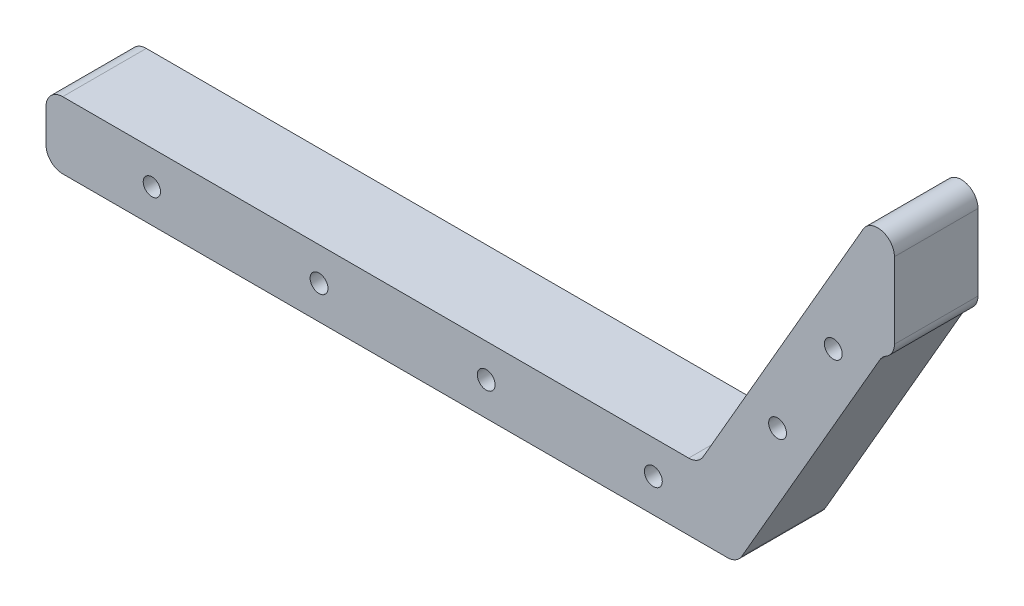
ISO-10303-21;
HEADER;
FILE_DESCRIPTION(('STEP AP214'),'2;1');
FILE_NAME('part.step','',(''),(''),'','','');
FILE_SCHEMA(('AUTOMOTIVE_DESIGN { 1 0 10303 214 1 1 1 1 }'));
ENDSEC;
DATA;
#1=APPLICATION_CONTEXT('core data for automotive mechanical design processes');
#2=APPLICATION_PROTOCOL_DEFINITION('international standard','automotive_design',2000,#1);
#3=PRODUCT_CONTEXT('',#1,'mechanical');
#4=PRODUCT('Part','Part','',(#3));
#5=PRODUCT_RELATED_PRODUCT_CATEGORY('part','',(#4));
#6=PRODUCT_DEFINITION_FORMATION('','',#4);
#7=PRODUCT_DEFINITION_CONTEXT('part definition',#1,'design');
#8=PRODUCT_DEFINITION('design','',#6,#7);
#9=PRODUCT_DEFINITION_SHAPE('','',#8);
#10=(LENGTH_UNIT() NAMED_UNIT(*) SI_UNIT(.MILLI.,.METRE.));
#11=(NAMED_UNIT(*) PLANE_ANGLE_UNIT() SI_UNIT($,.RADIAN.));
#12=(NAMED_UNIT(*) SI_UNIT($,.STERADIAN.) SOLID_ANGLE_UNIT());
#13=UNCERTAINTY_MEASURE_WITH_UNIT(LENGTH_MEASURE(1.E-05),#10,'distance_accuracy_value','');
#14=(GEOMETRIC_REPRESENTATION_CONTEXT(3) GLOBAL_UNCERTAINTY_ASSIGNED_CONTEXT((#13)) GLOBAL_UNIT_ASSIGNED_CONTEXT((#10,
#11,#12)) REPRESENTATION_CONTEXT('',''));
#15=CARTESIAN_POINT('',(0.,0.,0.));
#16=DIRECTION('',(0.,0.,1.));
#17=DIRECTION('',(1.,0.,0.));
#18=AXIS2_PLACEMENT_3D('',#15,#16,#17);
#19=CARTESIAN_POINT('',(80.2679491924311,3.00000000000004,15.));
#20=DIRECTION('',(0.,0.,1.));
#21=DIRECTION('',(1.,0.,0.));
#22=AXIS2_PLACEMENT_3D('',#19,#20,#21);
#23=PLANE('',#22);
#24=DIRECTION('',(0.,-1.,0.));
#25=VECTOR('',#24,1.);
#26=CARTESIAN_POINT('',(-42.,12.,15.));
#27=LINE('',#26,#25);
#28=CARTESIAN_POINT('',(-42.,8.99999999999998,15.));
#29=VERTEX_POINT('',#28);
#30=CARTESIAN_POINT('',(-42.,2.99999999999999,15.));
#31=VERTEX_POINT('',#30);
#32=EDGE_CURVE('E207',#29,#31,#27,.T.);
#33=ORIENTED_EDGE('',*,*,#32,.T.);
#34=CARTESIAN_POINT('',(-39.,2.99999999999999,15.));
#35=DIRECTION('',(0.,0.,1.));
#36=DIRECTION('',(1.,0.,0.));
#37=AXIS2_PLACEMENT_3D('',#34,#35,#36);
#38=CIRCLE('',#37,3.);
#39=CARTESIAN_POINT('',(-39.,0.,15.));
#40=VERTEX_POINT('',#39);
#41=EDGE_CURVE('E192',#31,#40,#38,.T.);
#42=ORIENTED_EDGE('',*,*,#41,.T.);
#43=DIRECTION('',(1.,0.,0.));
#44=VECTOR('',#43,1.);
#45=CARTESIAN_POINT('',(0.,0.,15.));
#46=LINE('',#45,#44);
#47=CARTESIAN_POINT('',(80.2679491924311,0.,15.));
#48=VERTEX_POINT('',#47);
#49=EDGE_CURVE('E153',#40,#48,#46,.T.);
#50=ORIENTED_EDGE('',*,*,#49,.T.);
#51=CARTESIAN_POINT('',(80.2679491924311,3.00000000000004,15.));
#52=DIRECTION('',(0.,0.,1.));
#53=DIRECTION('',(1.,0.,0.));
#54=AXIS2_PLACEMENT_3D('',#51,#52,#53);
#55=CIRCLE('',#54,3.);
#56=CARTESIAN_POINT('',(82.8660254037844,1.50000000000005,15.));
#57=VERTEX_POINT('',#56);
#58=EDGE_CURVE('E148',#48,#57,#55,.T.);
#59=ORIENTED_EDGE('',*,*,#58,.T.);
#60=DIRECTION('',(0.499999999999998,0.86602540378444,0.));
#61=VECTOR('',#60,1.);
#62=CARTESIAN_POINT('',(82.8660254037844,1.50000000000005,15.));
#63=LINE('',#62,#61);
#64=CARTESIAN_POINT('',(107.664319481613,44.451905283833,15.));
#65=VERTEX_POINT('',#64);
#66=EDGE_CURVE('E136',#57,#65,#63,.T.);
#67=ORIENTED_EDGE('',*,*,#66,.T.);
#68=CARTESIAN_POINT('',(110.262395692966,42.951905283833,15.));
#69=DIRECTION('',(0.,0.,-1.));
#70=DIRECTION('',(1.,0.,0.));
#71=AXIS2_PLACEMENT_3D('',#68,#69,#70);
#72=CIRCLE('',#71,3.);
#73=CARTESIAN_POINT('',(108.762395692966,45.5499814951863,15.));
#74=VERTEX_POINT('',#73);
#75=EDGE_CURVE('E147',#65,#74,#72,.T.);
#76=ORIENTED_EDGE('',*,*,#75,.T.);
#77=CARTESIAN_POINT('',(107.262395692966,48.1480577065396,15.));
#78=DIRECTION('',(0.,0.,1.));
#79=DIRECTION('',(1.,0.,0.));
#80=AXIS2_PLACEMENT_3D('',#77,#78,#79);
#81=CIRCLE('',#80,3.);
#82=CARTESIAN_POINT('',(110.262395692966,48.1480577065396,15.));
#83=VERTEX_POINT('',#82);
#84=EDGE_CURVE('E171',#74,#83,#81,.T.);
#85=ORIENTED_EDGE('',*,*,#84,.T.);
#86=DIRECTION('',(0.,1.,0.));
#87=VECTOR('',#86,1.);
#88=CARTESIAN_POINT('',(110.262395692966,45.951905283833,15.));
#89=LINE('',#88,#87);
#90=CARTESIAN_POINT('',(110.262395692966,61.7557528611264,15.));
#91=VERTEX_POINT('',#90);
#92=EDGE_CURVE('E290',#83,#91,#89,.T.);
#93=ORIENTED_EDGE('',*,*,#92,.T.);
#94=CARTESIAN_POINT('',(107.262395692966,61.7557528611264,15.));
#95=DIRECTION('',(0.,0.,1.));
#96=DIRECTION('',(1.,0.,0.));
#97=AXIS2_PLACEMENT_3D('',#94,#95,#96);
#98=CIRCLE('',#97,3.);
#99=CARTESIAN_POINT('',(104.664319481613,63.2557528611264,15.));
#100=VERTEX_POINT('',#99);
#101=EDGE_CURVE('E173',#91,#100,#98,.T.);
#102=ORIENTED_EDGE('',*,*,#101,.T.);
#103=DIRECTION('',(-0.499999999999998,-0.86602540378444,0.));
#104=VECTOR('',#103,1.);
#105=CARTESIAN_POINT('',(110.262395692966,72.9519052838331,15.));
#106=LINE('',#105,#104);
#107=CARTESIAN_POINT('',(75.9378221735089,13.5,15.));
#108=VERTEX_POINT('',#107);
#109=EDGE_CURVE('E293',#100,#108,#106,.T.);
#110=ORIENTED_EDGE('',*,*,#109,.T.);
#111=CARTESIAN_POINT('',(73.3397459621556,15.,15.));
#112=DIRECTION('',(0.,0.,-1.));
#113=DIRECTION('',(1.,0.,0.));
#114=AXIS2_PLACEMENT_3D('',#111,#112,#113);
#115=CIRCLE('',#114,3.);
#116=CARTESIAN_POINT('',(73.3397459621556,12.,15.));
#117=VERTEX_POINT('',#116);
#118=EDGE_CURVE('E217',#108,#117,#115,.T.);
#119=ORIENTED_EDGE('',*,*,#118,.T.);
#120=DIRECTION('',(-1.,0.,0.));
#121=VECTOR('',#120,1.);
#122=CARTESIAN_POINT('',(73.3397459621556,12.,15.));
#123=LINE('',#122,#121);
#124=CARTESIAN_POINT('',(-38.9999999999999,12.,15.));
#125=VERTEX_POINT('',#124);
#126=EDGE_CURVE('E212',#117,#125,#123,.T.);
#127=ORIENTED_EDGE('',*,*,#126,.T.);
#128=CARTESIAN_POINT('',(-39.,8.99999999999998,15.));
#129=DIRECTION('',(0.,0.,1.));
#130=DIRECTION('',(1.,0.,0.));
#131=AXIS2_PLACEMENT_3D('',#128,#129,#130);
#132=CIRCLE('',#131,3.);
#133=EDGE_CURVE('E190',#125,#29,#132,.T.);
#134=ORIENTED_EDGE('',*,*,#133,.T.);
#135=EDGE_LOOP('',(#33,#42,#50,#59,#67,#76,#85,#93,#102,#110,#119,#127,#134));
#136=FACE_BOUND('',#135,.T.);
#137=CARTESIAN_POINT('',(37.,6.00000000000001,15.));
#138=DIRECTION('',(0.,0.,1.));
#139=DIRECTION('',(1.,0.,0.));
#140=AXIS2_PLACEMENT_3D('',#137,#138,#139);
#141=CIRCLE('',#140,1.60000000000001);
#142=CARTESIAN_POINT('',(38.6,6.00000000000001,15.));
#143=VERTEX_POINT('',#142);
#144=EDGE_CURVE('E267',#143,#143,#141,.T.);
#145=ORIENTED_EDGE('',*,*,#144,.F.);
#146=EDGE_LOOP('',(#145));
#147=FACE_BOUND('',#146,.T.);
#148=CARTESIAN_POINT('',(89.2927405783631,24.6313972081442,15.));
#149=DIRECTION('',(0.,0.,1.));
#150=DIRECTION('',(1.,0.,0.));
#151=AXIS2_PLACEMENT_3D('',#148,#149,#150);
#152=CIRCLE('',#151,1.6);
#153=CARTESIAN_POINT('',(90.8927405783631,24.6313972081442,15.));
#154=VERTEX_POINT('',#153);
#155=EDGE_CURVE('E279',#154,#154,#152,.T.);
#156=ORIENTED_EDGE('',*,*,#155,.F.);
#157=EDGE_LOOP('',(#156));
#158=FACE_BOUND('',#157,.T.);
#159=CARTESIAN_POINT('',(99.2927405783631,41.951905283833,15.));
#160=DIRECTION('',(0.,0.,1.));
#161=DIRECTION('',(1.,0.,0.));
#162=AXIS2_PLACEMENT_3D('',#159,#160,#161);
#163=CIRCLE('',#162,1.6);
#164=CARTESIAN_POINT('',(100.892740578363,41.951905283833,15.));
#165=VERTEX_POINT('',#164);
#166=EDGE_CURVE('E223',#165,#165,#163,.T.);
#167=ORIENTED_EDGE('',*,*,#166,.F.);
#168=EDGE_LOOP('',(#167));
#169=FACE_BOUND('',#168,.T.);
#170=CARTESIAN_POINT('',(67.,6.00000000000001,15.));
#171=DIRECTION('',(0.,0.,1.));
#172=DIRECTION('',(1.,0.,0.));
#173=AXIS2_PLACEMENT_3D('',#170,#171,#172);
#174=CIRCLE('',#173,1.60000000000001);
#175=CARTESIAN_POINT('',(68.6,6.00000000000001,15.));
#176=VERTEX_POINT('',#175);
#177=EDGE_CURVE('E273',#176,#176,#174,.T.);
#178=ORIENTED_EDGE('',*,*,#177,.F.);
#179=EDGE_LOOP('',(#178));
#180=FACE_BOUND('',#179,.T.);
#181=CARTESIAN_POINT('',(6.99999999999998,6.00000000000001,15.));
#182=DIRECTION('',(0.,0.,1.));
#183=DIRECTION('',(1.,0.,0.));
#184=AXIS2_PLACEMENT_3D('',#181,#182,#183);
#185=CIRCLE('',#184,1.59999999999999);
#186=CARTESIAN_POINT('',(8.59999999999997,6.00000000000001,15.));
#187=VERTEX_POINT('',#186);
#188=EDGE_CURVE('E261',#187,#187,#185,.T.);
#189=ORIENTED_EDGE('',*,*,#188,.F.);
#190=EDGE_LOOP('',(#189));
#191=FACE_BOUND('',#190,.T.);
#192=CARTESIAN_POINT('',(-23.,5.99999999999999,15.));
#193=DIRECTION('',(0.,0.,1.));
#194=DIRECTION('',(1.,0.,0.));
#195=AXIS2_PLACEMENT_3D('',#192,#193,#194);
#196=CIRCLE('',#195,1.55);
#197=CARTESIAN_POINT('',(-21.45,5.99999999999999,15.));
#198=VERTEX_POINT('',#197);
#199=EDGE_CURVE('E257',#198,#198,#196,.T.);
#200=ORIENTED_EDGE('',*,*,#199,.F.);
#201=EDGE_LOOP('',(#200));
#202=FACE_BOUND('',#201,.T.);
#203=ADVANCED_FACE('F38',(#136,#147,#158,#169,#180,#191,#202),#23,.T.);
#204=CARTESIAN_POINT('',(80.2679491924311,3.00000000000004,0.));
#205=DIRECTION('',(0.,0.,1.));
#206=DIRECTION('',(1.,0.,0.));
#207=AXIS2_PLACEMENT_3D('',#204,#205,#206);
#208=PLANE('',#207);
#209=DIRECTION('',(1.,0.,0.));
#210=VECTOR('',#209,1.);
#211=CARTESIAN_POINT('',(0.,0.,0.));
#212=LINE('',#211,#210);
#213=CARTESIAN_POINT('',(-39.,0.,0.));
#214=VERTEX_POINT('',#213);
#215=CARTESIAN_POINT('',(80.2679491924311,0.,0.));
#216=VERTEX_POINT('',#215);
#217=EDGE_CURVE('E157',#214,#216,#212,.T.);
#218=ORIENTED_EDGE('',*,*,#217,.F.);
#219=CARTESIAN_POINT('',(-39.,2.99999999999999,0.));
#220=DIRECTION('',(0.,0.,1.));
#221=DIRECTION('',(1.,0.,0.));
#222=AXIS2_PLACEMENT_3D('',#219,#220,#221);
#223=CIRCLE('',#222,3.);
#224=CARTESIAN_POINT('',(-42.,2.99999999999999,0.));
#225=VERTEX_POINT('',#224);
#226=EDGE_CURVE('E46',#214,#225,#223,.F.);
#227=ORIENTED_EDGE('',*,*,#226,.T.);
#228=DIRECTION('',(0.,-1.,0.));
#229=VECTOR('',#228,1.);
#230=CARTESIAN_POINT('',(-42.,12.,0.));
#231=LINE('',#230,#229);
#232=CARTESIAN_POINT('',(-42.,8.99999999999998,0.));
#233=VERTEX_POINT('',#232);
#234=EDGE_CURVE('E199',#233,#225,#231,.T.);
#235=ORIENTED_EDGE('',*,*,#234,.F.);
#236=CARTESIAN_POINT('',(-39.,8.99999999999998,0.));
#237=DIRECTION('',(0.,0.,1.));
#238=DIRECTION('',(1.,0.,0.));
#239=AXIS2_PLACEMENT_3D('',#236,#237,#238);
#240=CIRCLE('',#239,3.);
#241=CARTESIAN_POINT('',(-38.9999999999999,12.,0.));
#242=VERTEX_POINT('',#241);
#243=EDGE_CURVE('E53',#233,#242,#240,.F.);
#244=ORIENTED_EDGE('',*,*,#243,.T.);
#245=DIRECTION('',(-1.,0.,0.));
#246=VECTOR('',#245,1.);
#247=CARTESIAN_POINT('',(73.3397459621556,12.,0.));
#248=LINE('',#247,#246);
#249=CARTESIAN_POINT('',(73.3397459621556,12.,0.));
#250=VERTEX_POINT('',#249);
#251=EDGE_CURVE('E235',#250,#242,#248,.T.);
#252=ORIENTED_EDGE('',*,*,#251,.F.);
#253=CARTESIAN_POINT('',(73.3397459621556,15.,0.));
#254=DIRECTION('',(0.,0.,-1.));
#255=DIRECTION('',(1.,0.,0.));
#256=AXIS2_PLACEMENT_3D('',#253,#254,#255);
#257=CIRCLE('',#256,3.);
#258=CARTESIAN_POINT('',(75.9378221735089,13.5,0.));
#259=VERTEX_POINT('',#258);
#260=EDGE_CURVE('E233',#259,#250,#257,.T.);
#261=ORIENTED_EDGE('',*,*,#260,.F.);
#262=DIRECTION('',(-0.499999999999998,-0.86602540378444,0.));
#263=VECTOR('',#262,1.);
#264=CARTESIAN_POINT('',(110.262395692966,72.9519052838331,0.));
#265=LINE('',#264,#263);
#266=CARTESIAN_POINT('',(104.664319481613,63.2557528611264,0.));
#267=VERTEX_POINT('',#266);
#268=EDGE_CURVE('E231',#267,#259,#265,.T.);
#269=ORIENTED_EDGE('',*,*,#268,.F.);
#270=CARTESIAN_POINT('',(107.262395692966,61.7557528611264,0.));
#271=DIRECTION('',(0.,0.,1.));
#272=DIRECTION('',(1.,0.,0.));
#273=AXIS2_PLACEMENT_3D('',#270,#271,#272);
#274=CIRCLE('',#273,3.);
#275=CARTESIAN_POINT('',(110.262395692966,61.7557528611264,0.));
#276=VERTEX_POINT('',#275);
#277=EDGE_CURVE('E164',#267,#276,#274,.F.);
#278=ORIENTED_EDGE('',*,*,#277,.T.);
#279=DIRECTION('',(0.,1.,0.));
#280=VECTOR('',#279,1.);
#281=CARTESIAN_POINT('',(110.262395692966,45.951905283833,0.));
#282=LINE('',#281,#280);
#283=CARTESIAN_POINT('',(110.262395692966,48.1480577065396,0.));
#284=VERTEX_POINT('',#283);
#285=EDGE_CURVE('E228',#284,#276,#282,.T.);
#286=ORIENTED_EDGE('',*,*,#285,.F.);
#287=CARTESIAN_POINT('',(107.262395692966,48.1480577065396,0.));
#288=DIRECTION('',(0.,0.,1.));
#289=DIRECTION('',(1.,0.,0.));
#290=AXIS2_PLACEMENT_3D('',#287,#288,#289);
#291=CIRCLE('',#290,3.);
#292=CARTESIAN_POINT('',(108.762395692966,45.5499814951863,0.));
#293=VERTEX_POINT('',#292);
#294=EDGE_CURVE('E162',#284,#293,#291,.F.);
#295=ORIENTED_EDGE('',*,*,#294,.T.);
#296=CARTESIAN_POINT('',(110.262395692966,42.951905283833,0.));
#297=DIRECTION('',(0.,0.,-1.));
#298=DIRECTION('',(1.,0.,0.));
#299=AXIS2_PLACEMENT_3D('',#296,#297,#298);
#300=CIRCLE('',#299,3.);
#301=CARTESIAN_POINT('',(107.664319481613,44.451905283833,0.));
#302=VERTEX_POINT('',#301);
#303=EDGE_CURVE('E225',#302,#293,#300,.T.);
#304=ORIENTED_EDGE('',*,*,#303,.F.);
#305=DIRECTION('',(0.499999999999998,0.86602540378444,0.));
#306=VECTOR('',#305,1.);
#307=CARTESIAN_POINT('',(82.8660254037844,1.50000000000005,0.));
#308=LINE('',#307,#306);
#309=CARTESIAN_POINT('',(82.8660254037844,1.50000000000005,0.));
#310=VERTEX_POINT('',#309);
#311=EDGE_CURVE('E222',#310,#302,#308,.T.);
#312=ORIENTED_EDGE('',*,*,#311,.F.);
#313=CARTESIAN_POINT('',(80.2679491924311,3.00000000000004,0.));
#314=DIRECTION('',(0.,0.,1.));
#315=DIRECTION('',(1.,0.,0.));
#316=AXIS2_PLACEMENT_3D('',#313,#314,#315);
#317=CIRCLE('',#316,3.);
#318=EDGE_CURVE('E161',#216,#310,#317,.T.);
#319=ORIENTED_EDGE('',*,*,#318,.F.);
#320=EDGE_LOOP('',(#218,#227,#235,#244,#252,#261,#269,#278,#286,#295,#304,#312,#319));
#321=FACE_BOUND('',#320,.T.);
#322=CARTESIAN_POINT('',(99.2927405783631,41.951905283833,0.));
#323=DIRECTION('',(0.,0.,1.));
#324=DIRECTION('',(1.,0.,0.));
#325=AXIS2_PLACEMENT_3D('',#322,#323,#324);
#326=CIRCLE('',#325,1.6);
#327=CARTESIAN_POINT('',(100.892740578363,41.951905283833,0.));
#328=VERTEX_POINT('',#327);
#329=EDGE_CURVE('E282',#328,#328,#326,.T.);
#330=ORIENTED_EDGE('',*,*,#329,.T.);
#331=EDGE_LOOP('',(#330));
#332=FACE_BOUND('',#331,.T.);
#333=CARTESIAN_POINT('',(89.2927405783631,24.6313972081442,0.));
#334=DIRECTION('',(0.,0.,1.));
#335=DIRECTION('',(1.,0.,0.));
#336=AXIS2_PLACEMENT_3D('',#333,#334,#335);
#337=CIRCLE('',#336,1.6);
#338=CARTESIAN_POINT('',(90.8927405783631,24.6313972081442,0.));
#339=VERTEX_POINT('',#338);
#340=EDGE_CURVE('E276',#339,#339,#337,.T.);
#341=ORIENTED_EDGE('',*,*,#340,.T.);
#342=EDGE_LOOP('',(#341));
#343=FACE_BOUND('',#342,.T.);
#344=CARTESIAN_POINT('',(67.,6.00000000000001,0.));
#345=DIRECTION('',(0.,0.,1.));
#346=DIRECTION('',(1.,0.,0.));
#347=AXIS2_PLACEMENT_3D('',#344,#345,#346);
#348=CIRCLE('',#347,1.60000000000001);
#349=CARTESIAN_POINT('',(68.6,6.00000000000001,0.));
#350=VERTEX_POINT('',#349);
#351=EDGE_CURVE('E270',#350,#350,#348,.T.);
#352=ORIENTED_EDGE('',*,*,#351,.T.);
#353=EDGE_LOOP('',(#352));
#354=FACE_BOUND('',#353,.T.);
#355=CARTESIAN_POINT('',(37.,6.00000000000001,0.));
#356=DIRECTION('',(0.,0.,1.));
#357=DIRECTION('',(1.,0.,0.));
#358=AXIS2_PLACEMENT_3D('',#355,#356,#357);
#359=CIRCLE('',#358,1.60000000000001);
#360=CARTESIAN_POINT('',(38.6,6.00000000000001,0.));
#361=VERTEX_POINT('',#360);
#362=EDGE_CURVE('E264',#361,#361,#359,.T.);
#363=ORIENTED_EDGE('',*,*,#362,.T.);
#364=EDGE_LOOP('',(#363));
#365=FACE_BOUND('',#364,.T.);
#366=CARTESIAN_POINT('',(6.99999999999998,6.00000000000001,0.));
#367=DIRECTION('',(0.,0.,1.));
#368=DIRECTION('',(1.,0.,0.));
#369=AXIS2_PLACEMENT_3D('',#366,#367,#368);
#370=CIRCLE('',#369,1.59999999999999);
#371=CARTESIAN_POINT('',(8.59999999999997,6.00000000000001,0.));
#372=VERTEX_POINT('',#371);
#373=EDGE_CURVE('E206',#372,#372,#370,.T.);
#374=ORIENTED_EDGE('',*,*,#373,.T.);
#375=EDGE_LOOP('',(#374));
#376=FACE_BOUND('',#375,.T.);
#377=CARTESIAN_POINT('',(-23.,5.99999999999999,0.));
#378=DIRECTION('',(0.,0.,1.));
#379=DIRECTION('',(1.,0.,0.));
#380=AXIS2_PLACEMENT_3D('',#377,#378,#379);
#381=CIRCLE('',#380,1.55);
#382=CARTESIAN_POINT('',(-21.45,5.99999999999999,0.));
#383=VERTEX_POINT('',#382);
#384=EDGE_CURVE('E254',#383,#383,#381,.T.);
#385=ORIENTED_EDGE('',*,*,#384,.T.);
#386=EDGE_LOOP('',(#385));
#387=FACE_BOUND('',#386,.T.);
#388=ADVANCED_FACE('F197',(#321,#332,#343,#354,#365,#376,#387),#208,.F.);
#389=CARTESIAN_POINT('',(80.2679491924311,3.00000000000004,15.));
#390=DIRECTION('',(0.,0.,-1.));
#391=DIRECTION('',(-1.,0.,0.));
#392=AXIS2_PLACEMENT_3D('',#389,#390,#391);
#393=CYLINDRICAL_SURFACE('',#392,3.);
#394=ORIENTED_EDGE('',*,*,#318,.T.);
#395=DIRECTION('',(0.,0.,-1.));
#396=VECTOR('',#395,1.);
#397=CARTESIAN_POINT('',(82.8660254037844,1.50000000000005,15.));
#398=LINE('',#397,#396);
#399=EDGE_CURVE('E140',#57,#310,#398,.T.);
#400=ORIENTED_EDGE('',*,*,#399,.F.);
#401=ORIENTED_EDGE('',*,*,#58,.F.);
#402=DIRECTION('',(0.,0.,-1.));
#403=VECTOR('',#402,1.);
#404=CARTESIAN_POINT('',(80.2679491924311,0.,15.));
#405=LINE('',#404,#403);
#406=EDGE_CURVE('E211',#48,#216,#405,.T.);
#407=ORIENTED_EDGE('',*,*,#406,.T.);
#408=EDGE_LOOP('',(#394,#400,#401,#407));
#409=FACE_BOUND('',#408,.T.);
#410=ADVANCED_FACE('F159',(#409),#393,.T.);
#411=CARTESIAN_POINT('',(82.8660254037844,1.50000000000005,15.));
#412=DIRECTION('',(-0.86602540378444,0.499999999999998,0.));
#413=DIRECTION('',(-0.499999999999998,-0.86602540378444,0.));
#414=AXIS2_PLACEMENT_3D('',#411,#412,#413);
#415=PLANE('',#414);
#416=ORIENTED_EDGE('',*,*,#311,.T.);
#417=DIRECTION('',(0.,0.,-1.));
#418=VECTOR('',#417,1.);
#419=CARTESIAN_POINT('',(107.664319481613,44.451905283833,15.));
#420=LINE('',#419,#418);
#421=EDGE_CURVE('E143',#65,#302,#420,.T.);
#422=ORIENTED_EDGE('',*,*,#421,.F.);
#423=ORIENTED_EDGE('',*,*,#66,.F.);
#424=ORIENTED_EDGE('',*,*,#399,.T.);
#425=EDGE_LOOP('',(#416,#422,#423,#424));
#426=FACE_BOUND('',#425,.T.);
#427=ADVANCED_FACE('F138',(#426),#415,.F.);
#428=CARTESIAN_POINT('',(110.262395692966,42.951905283833,15.));
#429=DIRECTION('',(0.,0.,-1.));
#430=DIRECTION('',(-1.,0.,0.));
#431=AXIS2_PLACEMENT_3D('',#428,#429,#430);
#432=CYLINDRICAL_SURFACE('',#431,3.);
#433=ORIENTED_EDGE('',*,*,#303,.T.);
#434=DIRECTION('',(0.,0.,-1.));
#435=VECTOR('',#434,1.);
#436=CARTESIAN_POINT('',(108.762395692966,45.5499814951863,15.));
#437=LINE('',#436,#435);
#438=EDGE_CURVE('E183',#293,#74,#437,.F.);
#439=ORIENTED_EDGE('',*,*,#438,.T.);
#440=ORIENTED_EDGE('',*,*,#75,.F.);
#441=ORIENTED_EDGE('',*,*,#421,.T.);
#442=EDGE_LOOP('',(#433,#439,#440,#441));
#443=FACE_BOUND('',#442,.T.);
#444=ADVANCED_FACE('F311',(#443),#432,.F.);
#445=CARTESIAN_POINT('',(110.262395692966,45.951905283833,15.));
#446=DIRECTION('',(-1.,0.,0.));
#447=DIRECTION('',(0.,0.,1.));
#448=AXIS2_PLACEMENT_3D('',#445,#446,#447);
#449=PLANE('',#448);
#450=ORIENTED_EDGE('',*,*,#285,.T.);
#451=DIRECTION('',(0.,0.,-1.));
#452=VECTOR('',#451,1.);
#453=CARTESIAN_POINT('',(110.262395692966,61.7557528611264,15.));
#454=LINE('',#453,#452);
#455=EDGE_CURVE('E181',#276,#91,#454,.F.);
#456=ORIENTED_EDGE('',*,*,#455,.T.);
#457=ORIENTED_EDGE('',*,*,#92,.F.);
#458=DIRECTION('',(0.,0.,-1.));
#459=VECTOR('',#458,1.);
#460=CARTESIAN_POINT('',(110.262395692966,48.1480577065396,15.));
#461=LINE('',#460,#459);
#462=EDGE_CURVE('E178',#83,#284,#461,.T.);
#463=ORIENTED_EDGE('',*,*,#462,.T.);
#464=EDGE_LOOP('',(#450,#456,#457,#463));
#465=FACE_BOUND('',#464,.T.);
#466=ADVANCED_FACE('F302',(#465),#449,.F.);
#467=CARTESIAN_POINT('',(110.262395692966,72.9519052838331,15.));
#468=DIRECTION('',(0.86602540378444,-0.499999999999998,0.));
#469=DIRECTION('',(0.499999999999998,0.86602540378444,0.));
#470=AXIS2_PLACEMENT_3D('',#467,#468,#469);
#471=PLANE('',#470);
#472=ORIENTED_EDGE('',*,*,#109,.F.);
#473=DIRECTION('',(0.,0.,-1.));
#474=VECTOR('',#473,1.);
#475=CARTESIAN_POINT('',(104.664319481613,63.2557528611264,15.));
#476=LINE('',#475,#474);
#477=EDGE_CURVE('E175',#100,#267,#476,.T.);
#478=ORIENTED_EDGE('',*,*,#477,.T.);
#479=ORIENTED_EDGE('',*,*,#268,.T.);
#480=DIRECTION('',(0.,0.,-1.));
#481=VECTOR('',#480,1.);
#482=CARTESIAN_POINT('',(75.9378221735089,13.5,15.));
#483=LINE('',#482,#481);
#484=EDGE_CURVE('E166',#108,#259,#483,.T.);
#485=ORIENTED_EDGE('',*,*,#484,.F.);
#486=EDGE_LOOP('',(#472,#478,#479,#485));
#487=FACE_BOUND('',#486,.T.);
#488=ADVANCED_FACE('F296',(#487),#471,.F.);
#489=CARTESIAN_POINT('',(73.3397459621556,15.,15.));
#490=DIRECTION('',(0.,0.,-1.));
#491=DIRECTION('',(-1.,0.,0.));
#492=AXIS2_PLACEMENT_3D('',#489,#490,#491);
#493=CYLINDRICAL_SURFACE('',#492,3.);
#494=ORIENTED_EDGE('',*,*,#260,.T.);
#495=DIRECTION('',(0.,0.,-1.));
#496=VECTOR('',#495,1.);
#497=CARTESIAN_POINT('',(73.3397459621556,12.,15.));
#498=LINE('',#497,#496);
#499=EDGE_CURVE('E214',#117,#250,#498,.T.);
#500=ORIENTED_EDGE('',*,*,#499,.F.);
#501=ORIENTED_EDGE('',*,*,#118,.F.);
#502=ORIENTED_EDGE('',*,*,#484,.T.);
#503=EDGE_LOOP('',(#494,#500,#501,#502));
#504=FACE_BOUND('',#503,.T.);
#505=ADVANCED_FACE('F244',(#504),#493,.F.);
#506=CARTESIAN_POINT('',(73.3397459621556,12.,15.));
#507=DIRECTION('',(0.,-1.,0.));
#508=DIRECTION('',(1.,0.,0.));
#509=AXIS2_PLACEMENT_3D('',#506,#507,#508);
#510=PLANE('',#509);
#511=ORIENTED_EDGE('',*,*,#251,.T.);
#512=DIRECTION('',(0.,0.,1.));
#513=VECTOR('',#512,1.);
#514=CARTESIAN_POINT('',(-39.,12.,15.));
#515=LINE('',#514,#513);
#516=EDGE_CURVE('E11',#242,#125,#515,.T.);
#517=ORIENTED_EDGE('',*,*,#516,.T.);
#518=ORIENTED_EDGE('',*,*,#126,.F.);
#519=ORIENTED_EDGE('',*,*,#499,.T.);
#520=EDGE_LOOP('',(#511,#517,#518,#519));
#521=FACE_BOUND('',#520,.T.);
#522=ADVANCED_FACE('F251',(#521),#510,.F.);
#523=CARTESIAN_POINT('',(0.,0.,15.));
#524=DIRECTION('',(0.,1.,0.));
#525=DIRECTION('',(-1.,0.,0.));
#526=AXIS2_PLACEMENT_3D('',#523,#524,#525);
#527=PLANE('',#526);
#528=ORIENTED_EDGE('',*,*,#49,.F.);
#529=DIRECTION('',(0.,0.,1.));
#530=VECTOR('',#529,1.);
#531=CARTESIAN_POINT('',(-39.,0.,0.));
#532=LINE('',#531,#530);
#533=EDGE_CURVE('E61',#40,#214,#532,.F.);
#534=ORIENTED_EDGE('',*,*,#533,.T.);
#535=ORIENTED_EDGE('',*,*,#217,.T.);
#536=ORIENTED_EDGE('',*,*,#406,.F.);
#537=EDGE_LOOP('',(#528,#534,#535,#536));
#538=FACE_BOUND('',#537,.T.);
#539=ADVANCED_FACE('F210',(#538),#527,.F.);
#540=CARTESIAN_POINT('',(99.2927405783631,41.951905283833,15.));
#541=DIRECTION('',(0.,0.,-1.));
#542=DIRECTION('',(-1.,0.,0.));
#543=AXIS2_PLACEMENT_3D('',#540,#541,#542);
#544=CYLINDRICAL_SURFACE('',#543,1.6);
#545=ORIENTED_EDGE('',*,*,#166,.T.);
#546=EDGE_LOOP('',(#545));
#547=FACE_BOUND('',#546,.T.);
#548=ORIENTED_EDGE('',*,*,#329,.F.);
#549=EDGE_LOOP('',(#548));
#550=FACE_BOUND('',#549,.T.);
#551=ADVANCED_FACE('F327',(#547,#550),#544,.F.);
#552=CARTESIAN_POINT('',(89.2927405783631,24.6313972081442,15.));
#553=DIRECTION('',(0.,0.,-1.));
#554=DIRECTION('',(-1.,0.,0.));
#555=AXIS2_PLACEMENT_3D('',#552,#553,#554);
#556=CYLINDRICAL_SURFACE('',#555,1.6);
#557=ORIENTED_EDGE('',*,*,#155,.T.);
#558=EDGE_LOOP('',(#557));
#559=FACE_BOUND('',#558,.T.);
#560=ORIENTED_EDGE('',*,*,#340,.F.);
#561=EDGE_LOOP('',(#560));
#562=FACE_BOUND('',#561,.T.);
#563=ADVANCED_FACE('F363',(#559,#562),#556,.F.);
#564=CARTESIAN_POINT('',(67.,6.00000000000001,15.));
#565=DIRECTION('',(0.,0.,-1.));
#566=DIRECTION('',(-1.,0.,0.));
#567=AXIS2_PLACEMENT_3D('',#564,#565,#566);
#568=CYLINDRICAL_SURFACE('',#567,1.60000000000001);
#569=ORIENTED_EDGE('',*,*,#177,.T.);
#570=EDGE_LOOP('',(#569));
#571=FACE_BOUND('',#570,.T.);
#572=ORIENTED_EDGE('',*,*,#351,.F.);
#573=EDGE_LOOP('',(#572));
#574=FACE_BOUND('',#573,.T.);
#575=ADVANCED_FACE('F370',(#571,#574),#568,.F.);
#576=CARTESIAN_POINT('',(37.,6.00000000000001,15.));
#577=DIRECTION('',(0.,0.,-1.));
#578=DIRECTION('',(-1.,0.,0.));
#579=AXIS2_PLACEMENT_3D('',#576,#577,#578);
#580=CYLINDRICAL_SURFACE('',#579,1.60000000000001);
#581=ORIENTED_EDGE('',*,*,#144,.T.);
#582=EDGE_LOOP('',(#581));
#583=FACE_BOUND('',#582,.T.);
#584=ORIENTED_EDGE('',*,*,#362,.F.);
#585=EDGE_LOOP('',(#584));
#586=FACE_BOUND('',#585,.T.);
#587=ADVANCED_FACE('F377',(#583,#586),#580,.F.);
#588=CARTESIAN_POINT('',(6.99999999999998,6.00000000000001,15.));
#589=DIRECTION('',(0.,0.,-1.));
#590=DIRECTION('',(-1.,0.,0.));
#591=AXIS2_PLACEMENT_3D('',#588,#589,#590);
#592=CYLINDRICAL_SURFACE('',#591,1.59999999999999);
#593=ORIENTED_EDGE('',*,*,#188,.T.);
#594=EDGE_LOOP('',(#593));
#595=FACE_BOUND('',#594,.T.);
#596=ORIENTED_EDGE('',*,*,#373,.F.);
#597=EDGE_LOOP('',(#596));
#598=FACE_BOUND('',#597,.T.);
#599=ADVANCED_FACE('F385',(#595,#598),#592,.F.);
#600=CARTESIAN_POINT('',(107.262395692966,61.7557528611264,15.));
#601=DIRECTION('',(0.,0.,-1.));
#602=DIRECTION('',(-1.,0.,0.));
#603=AXIS2_PLACEMENT_3D('',#600,#601,#602);
#604=CYLINDRICAL_SURFACE('',#603,3.);
#605=ORIENTED_EDGE('',*,*,#101,.F.);
#606=ORIENTED_EDGE('',*,*,#455,.F.);
#607=ORIENTED_EDGE('',*,*,#277,.F.);
#608=ORIENTED_EDGE('',*,*,#477,.F.);
#609=EDGE_LOOP('',(#605,#606,#607,#608));
#610=FACE_BOUND('',#609,.T.);
#611=ADVANCED_FACE('F298',(#610),#604,.T.);
#612=CARTESIAN_POINT('',(107.262395692966,48.1480577065396,15.));
#613=DIRECTION('',(0.,0.,-1.));
#614=DIRECTION('',(-1.,0.,0.));
#615=AXIS2_PLACEMENT_3D('',#612,#613,#614);
#616=CYLINDRICAL_SURFACE('',#615,3.);
#617=ORIENTED_EDGE('',*,*,#84,.F.);
#618=ORIENTED_EDGE('',*,*,#438,.F.);
#619=ORIENTED_EDGE('',*,*,#294,.F.);
#620=ORIENTED_EDGE('',*,*,#462,.F.);
#621=EDGE_LOOP('',(#617,#618,#619,#620));
#622=FACE_BOUND('',#621,.T.);
#623=ADVANCED_FACE('F307',(#622),#616,.T.);
#624=CARTESIAN_POINT('',(-42.,12.,0.));
#625=DIRECTION('',(-1.,0.,0.));
#626=DIRECTION('',(0.,0.,1.));
#627=AXIS2_PLACEMENT_3D('',#624,#625,#626);
#628=PLANE('',#627);
#629=ORIENTED_EDGE('',*,*,#234,.T.);
#630=DIRECTION('',(0.,0.,1.));
#631=VECTOR('',#630,1.);
#632=CARTESIAN_POINT('',(-42.,2.99999999999999,15.));
#633=LINE('',#632,#631);
#634=EDGE_CURVE('E187',#225,#31,#633,.T.);
#635=ORIENTED_EDGE('',*,*,#634,.T.);
#636=ORIENTED_EDGE('',*,*,#32,.F.);
#637=DIRECTION('',(0.,0.,1.));
#638=VECTOR('',#637,1.);
#639=CARTESIAN_POINT('',(-42.,8.99999999999998,0.));
#640=LINE('',#639,#638);
#641=EDGE_CURVE('E185',#29,#233,#640,.F.);
#642=ORIENTED_EDGE('',*,*,#641,.T.);
#643=EDGE_LOOP('',(#629,#635,#636,#642));
#644=FACE_BOUND('',#643,.T.);
#645=ADVANCED_FACE('F203',(#644),#628,.T.);
#646=CARTESIAN_POINT('',(-23.,5.99999999999999,0.));
#647=DIRECTION('',(0.,0.,1.));
#648=DIRECTION('',(1.,0.,0.));
#649=AXIS2_PLACEMENT_3D('',#646,#647,#648);
#650=CYLINDRICAL_SURFACE('',#649,1.55);
#651=ORIENTED_EDGE('',*,*,#384,.F.);
#652=EDGE_LOOP('',(#651));
#653=FACE_BOUND('',#652,.T.);
#654=ORIENTED_EDGE('',*,*,#199,.T.);
#655=EDGE_LOOP('',(#654));
#656=FACE_BOUND('',#655,.T.);
#657=ADVANCED_FACE('F411',(#653,#656),#650,.F.);
#658=CARTESIAN_POINT('',(-39.,2.99999999999999,0.));
#659=DIRECTION('',(0.,0.,-1.));
#660=DIRECTION('',(-1.,0.,0.));
#661=AXIS2_PLACEMENT_3D('',#658,#659,#660);
#662=CYLINDRICAL_SURFACE('',#661,3.);
#663=ORIENTED_EDGE('',*,*,#226,.F.);
#664=ORIENTED_EDGE('',*,*,#533,.F.);
#665=ORIENTED_EDGE('',*,*,#41,.F.);
#666=ORIENTED_EDGE('',*,*,#634,.F.);
#667=EDGE_LOOP('',(#663,#664,#665,#666));
#668=FACE_BOUND('',#667,.T.);
#669=ADVANCED_FACE('F209',(#668),#662,.T.);
#670=CARTESIAN_POINT('',(-39.,8.99999999999998,15.));
#671=DIRECTION('',(0.,0.,-1.));
#672=DIRECTION('',(-1.,0.,0.));
#673=AXIS2_PLACEMENT_3D('',#670,#671,#672);
#674=CYLINDRICAL_SURFACE('',#673,3.);
#675=ORIENTED_EDGE('',*,*,#243,.F.);
#676=ORIENTED_EDGE('',*,*,#641,.F.);
#677=ORIENTED_EDGE('',*,*,#133,.F.);
#678=ORIENTED_EDGE('',*,*,#516,.F.);
#679=EDGE_LOOP('',(#675,#676,#677,#678));
#680=FACE_BOUND('',#679,.T.);
#681=ADVANCED_FACE('F40',(#680),#674,.T.);
#682=CLOSED_SHELL('',(#203,#388,#410,#427,#444,#466,#488,#505,#522,#539,#551,#563,#575,#587,
#599,#611,#623,#645,#657,#669,#681));
#683=MANIFOLD_SOLID_BREP('B2',#682);
#684=ADVANCED_BREP_SHAPE_REPRESENTATION('',(#18,#683),#14);
#685=SHAPE_DEFINITION_REPRESENTATION(#9,#684);
ENDSEC;
END-ISO-10303-21;
